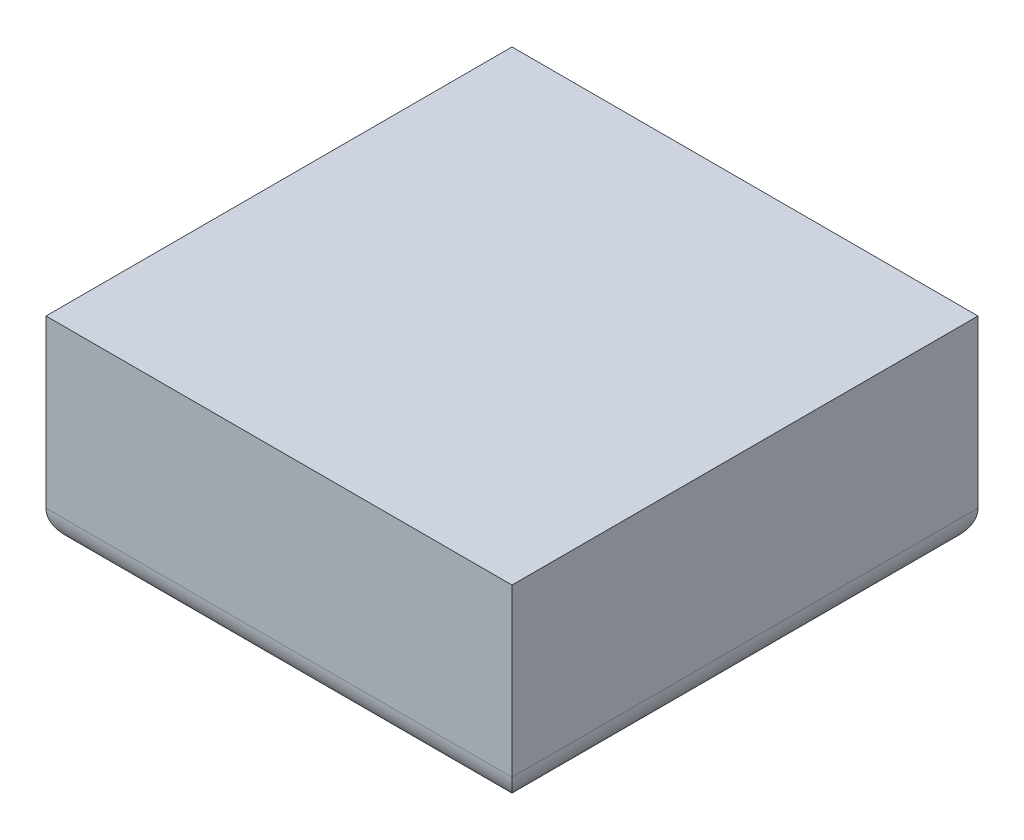
ISO-10303-21;
HEADER;
FILE_DESCRIPTION(('STEP AP214'),'2;1');
FILE_NAME('part.step','',(''),(''),'','','');
FILE_SCHEMA(('AUTOMOTIVE_DESIGN { 1 0 10303 214 1 1 1 1 }'));
ENDSEC;
DATA;
#1=APPLICATION_CONTEXT('core data for automotive mechanical design processes');
#2=APPLICATION_PROTOCOL_DEFINITION('international standard','automotive_design',2000,#1);
#3=PRODUCT_CONTEXT('',#1,'mechanical');
#4=PRODUCT('Part','Part','',(#3));
#5=PRODUCT_RELATED_PRODUCT_CATEGORY('part','',(#4));
#6=PRODUCT_DEFINITION_FORMATION('','',#4);
#7=PRODUCT_DEFINITION_CONTEXT('part definition',#1,'design');
#8=PRODUCT_DEFINITION('design','',#6,#7);
#9=PRODUCT_DEFINITION_SHAPE('','',#8);
#10=(LENGTH_UNIT() NAMED_UNIT(*) SI_UNIT(.MILLI.,.METRE.));
#11=(NAMED_UNIT(*) PLANE_ANGLE_UNIT() SI_UNIT($,.RADIAN.));
#12=(NAMED_UNIT(*) SI_UNIT($,.STERADIAN.) SOLID_ANGLE_UNIT());
#13=UNCERTAINTY_MEASURE_WITH_UNIT(LENGTH_MEASURE(1.E-05),#10,'distance_accuracy_value','');
#14=(GEOMETRIC_REPRESENTATION_CONTEXT(3) GLOBAL_UNCERTAINTY_ASSIGNED_CONTEXT((#13)) GLOBAL_UNIT_ASSIGNED_CONTEXT((#10,
#11,#12)) REPRESENTATION_CONTEXT('',''));
#15=CARTESIAN_POINT('',(0.,0.,0.));
#16=DIRECTION('',(0.,0.,1.));
#17=DIRECTION('',(1.,0.,0.));
#18=AXIS2_PLACEMENT_3D('',#15,#16,#17);
#19=CARTESIAN_POINT('',(0.,30.,0.));
#20=DIRECTION('',(1.,0.,0.));
#21=DIRECTION('',(0.,0.,-1.));
#22=AXIS2_PLACEMENT_3D('',#19,#20,#21);
#23=PLANE('',#22);
#24=DIRECTION('',(0.,-1.,0.));
#25=VECTOR('',#24,1.);
#26=CARTESIAN_POINT('',(0.,30.,-70.));
#27=LINE('',#26,#25);
#28=CARTESIAN_POINT('',(0.,30.,-70.));
#29=VERTEX_POINT('',#28);
#30=CARTESIAN_POINT('',(0.,5.,-70.));
#31=VERTEX_POINT('',#30);
#32=EDGE_CURVE('E156',#29,#31,#27,.T.);
#33=ORIENTED_EDGE('',*,*,#32,.T.);
#34=DIRECTION('',(0.,0.,1.));
#35=VECTOR('',#34,1.);
#36=CARTESIAN_POINT('',(0.,5.,0.));
#37=LINE('',#36,#35);
#38=CARTESIAN_POINT('',(0.,5.,0.));
#39=VERTEX_POINT('',#38);
#40=EDGE_CURVE('E11',#31,#39,#37,.T.);
#41=ORIENTED_EDGE('',*,*,#40,.T.);
#42=DIRECTION('',(0.,-1.,0.));
#43=VECTOR('',#42,1.);
#44=CARTESIAN_POINT('',(0.,30.,0.));
#45=LINE('',#44,#43);
#46=CARTESIAN_POINT('',(0.,30.,0.));
#47=VERTEX_POINT('',#46);
#48=EDGE_CURVE('E98',#47,#39,#45,.T.);
#49=ORIENTED_EDGE('',*,*,#48,.F.);
#50=DIRECTION('',(0.,0.,1.));
#51=VECTOR('',#50,1.);
#52=CARTESIAN_POINT('',(0.,30.,0.));
#53=LINE('',#52,#51);
#54=EDGE_CURVE('E104',#29,#47,#53,.T.);
#55=ORIENTED_EDGE('',*,*,#54,.F.);
#56=EDGE_LOOP('',(#33,#41,#49,#55));
#57=FACE_BOUND('',#56,.T.);
#58=ADVANCED_FACE('F37',(#57),#23,.F.);
#59=CARTESIAN_POINT('',(0.,30.,0.));
#60=DIRECTION('',(0.,0.,-1.));
#61=DIRECTION('',(-1.,0.,0.));
#62=AXIS2_PLACEMENT_3D('',#59,#60,#61);
#63=PLANE('',#62);
#64=ORIENTED_EDGE('',*,*,#48,.T.);
#65=DIRECTION('',(1.,0.,0.));
#66=VECTOR('',#65,1.);
#67=CARTESIAN_POINT('',(70.,5.,0.));
#68=LINE('',#67,#66);
#69=CARTESIAN_POINT('',(70.,5.,0.));
#70=VERTEX_POINT('',#69);
#71=EDGE_CURVE('E113',#39,#70,#68,.T.);
#72=ORIENTED_EDGE('',*,*,#71,.T.);
#73=DIRECTION('',(0.,-1.,0.));
#74=VECTOR('',#73,1.);
#75=CARTESIAN_POINT('',(70.,30.,0.));
#76=LINE('',#75,#74);
#77=CARTESIAN_POINT('',(70.,30.,0.));
#78=VERTEX_POINT('',#77);
#79=EDGE_CURVE('E100',#78,#70,#76,.T.);
#80=ORIENTED_EDGE('',*,*,#79,.F.);
#81=DIRECTION('',(1.,0.,0.));
#82=VECTOR('',#81,1.);
#83=CARTESIAN_POINT('',(0.,30.,0.));
#84=LINE('',#83,#82);
#85=EDGE_CURVE('E93',#47,#78,#84,.T.);
#86=ORIENTED_EDGE('',*,*,#85,.F.);
#87=EDGE_LOOP('',(#64,#72,#80,#86));
#88=FACE_BOUND('',#87,.T.);
#89=ADVANCED_FACE('F95',(#88),#63,.F.);
#90=CARTESIAN_POINT('',(70.,30.,0.));
#91=DIRECTION('',(-1.,0.,0.));
#92=DIRECTION('',(0.,0.,1.));
#93=AXIS2_PLACEMENT_3D('',#90,#91,#92);
#94=PLANE('',#93);
#95=ORIENTED_EDGE('',*,*,#79,.T.);
#96=DIRECTION('',(0.,0.,-1.));
#97=VECTOR('',#96,1.);
#98=CARTESIAN_POINT('',(70.,5.,-70.));
#99=LINE('',#98,#97);
#100=CARTESIAN_POINT('',(70.,5.,-70.));
#101=VERTEX_POINT('',#100);
#102=EDGE_CURVE('E61',#70,#101,#99,.T.);
#103=ORIENTED_EDGE('',*,*,#102,.T.);
#104=DIRECTION('',(0.,-1.,0.));
#105=VECTOR('',#104,1.);
#106=CARTESIAN_POINT('',(70.,30.,-70.));
#107=LINE('',#106,#105);
#108=CARTESIAN_POINT('',(70.,30.,-70.));
#109=VERTEX_POINT('',#108);
#110=EDGE_CURVE('E117',#109,#101,#107,.T.);
#111=ORIENTED_EDGE('',*,*,#110,.F.);
#112=DIRECTION('',(0.,0.,-1.));
#113=VECTOR('',#112,1.);
#114=CARTESIAN_POINT('',(70.,30.,0.));
#115=LINE('',#114,#113);
#116=EDGE_CURVE('E103',#78,#109,#115,.T.);
#117=ORIENTED_EDGE('',*,*,#116,.F.);
#118=EDGE_LOOP('',(#95,#103,#111,#117));
#119=FACE_BOUND('',#118,.T.);
#120=ADVANCED_FACE('F154',(#119),#94,.F.);
#121=CARTESIAN_POINT('',(0.,30.,-70.));
#122=DIRECTION('',(0.,0.,1.));
#123=DIRECTION('',(1.,0.,0.));
#124=AXIS2_PLACEMENT_3D('',#121,#122,#123);
#125=PLANE('',#124);
#126=ORIENTED_EDGE('',*,*,#110,.T.);
#127=DIRECTION('',(-1.,0.,0.));
#128=VECTOR('',#127,1.);
#129=CARTESIAN_POINT('',(0.,5.,-70.));
#130=LINE('',#129,#128);
#131=EDGE_CURVE('E46',#101,#31,#130,.T.);
#132=ORIENTED_EDGE('',*,*,#131,.T.);
#133=ORIENTED_EDGE('',*,*,#32,.F.);
#134=DIRECTION('',(-1.,0.,0.));
#135=VECTOR('',#134,1.);
#136=CARTESIAN_POINT('',(0.,30.,-70.));
#137=LINE('',#136,#135);
#138=EDGE_CURVE('E109',#109,#29,#137,.T.);
#139=ORIENTED_EDGE('',*,*,#138,.F.);
#140=EDGE_LOOP('',(#126,#132,#133,#139));
#141=FACE_BOUND('',#140,.T.);
#142=ADVANCED_FACE('F159',(#141),#125,.F.);
#143=CARTESIAN_POINT('',(0.,30.,0.));
#144=DIRECTION('',(0.,-1.,0.));
#145=DIRECTION('',(0.,0.,-1.));
#146=AXIS2_PLACEMENT_3D('',#143,#144,#145);
#147=PLANE('',#146);
#148=ORIENTED_EDGE('',*,*,#54,.T.);
#149=ORIENTED_EDGE('',*,*,#85,.T.);
#150=ORIENTED_EDGE('',*,*,#116,.T.);
#151=ORIENTED_EDGE('',*,*,#138,.T.);
#152=EDGE_LOOP('',(#148,#149,#150,#151));
#153=FACE_BOUND('',#152,.T.);
#154=ADVANCED_FACE('F107',(#153),#147,.F.);
#155=CARTESIAN_POINT('',(0.,0.,0.));
#156=DIRECTION('',(0.,-1.,0.));
#157=DIRECTION('',(0.,0.,-1.));
#158=AXIS2_PLACEMENT_3D('',#155,#156,#157);
#159=PLANE('',#158);
#160=DIRECTION('',(0.,0.,-1.));
#161=VECTOR('',#160,1.);
#162=CARTESIAN_POINT('',(65.,0.,0.));
#163=LINE('',#162,#161);
#164=CARTESIAN_POINT('',(65.,0.,-65.));
#165=VERTEX_POINT('',#164);
#166=CARTESIAN_POINT('',(65.,0.,-5.));
#167=VERTEX_POINT('',#166);
#168=EDGE_CURVE('E124',#165,#167,#163,.F.);
#169=ORIENTED_EDGE('',*,*,#168,.T.);
#170=DIRECTION('',(1.,0.,0.));
#171=VECTOR('',#170,1.);
#172=CARTESIAN_POINT('',(0.,0.,-5.));
#173=LINE('',#172,#171);
#174=CARTESIAN_POINT('',(5.,0.,-5.));
#175=VERTEX_POINT('',#174);
#176=EDGE_CURVE('E126',#167,#175,#173,.F.);
#177=ORIENTED_EDGE('',*,*,#176,.T.);
#178=DIRECTION('',(0.,0.,1.));
#179=VECTOR('',#178,1.);
#180=CARTESIAN_POINT('',(5.,0.,-70.));
#181=LINE('',#180,#179);
#182=CARTESIAN_POINT('',(5.,0.,-65.));
#183=VERTEX_POINT('',#182);
#184=EDGE_CURVE('E115',#175,#183,#181,.F.);
#185=ORIENTED_EDGE('',*,*,#184,.T.);
#186=DIRECTION('',(-1.,0.,0.));
#187=VECTOR('',#186,1.);
#188=CARTESIAN_POINT('',(70.,0.,-65.));
#189=LINE('',#188,#187);
#190=EDGE_CURVE('E122',#183,#165,#189,.F.);
#191=ORIENTED_EDGE('',*,*,#190,.T.);
#192=EDGE_LOOP('',(#169,#177,#185,#191));
#193=FACE_BOUND('',#192,.T.);
#194=ADVANCED_FACE('F147',(#193),#159,.T.);
#195=CARTESIAN_POINT('',(0.,5.,-65.));
#196=DIRECTION('',(1.,0.,0.));
#197=DIRECTION('',(0.,0.,-1.));
#198=AXIS2_PLACEMENT_3D('',#195,#196,#197);
#199=CYLINDRICAL_SURFACE('',#198,5.);
#200=CARTESIAN_POINT('',(65.,5.,-65.));
#201=DIRECTION('',(0.707106781186547,0.,0.707106781186547));
#202=DIRECTION('',(0.707106781186547,0.,-0.707106781186547));
#203=AXIS2_PLACEMENT_3D('',#200,#201,#202);
#204=ELLIPSE('',#203,7.07106781186547,5.);
#205=EDGE_CURVE('E134',#165,#101,#204,.T.);
#206=ORIENTED_EDGE('',*,*,#205,.F.);
#207=ORIENTED_EDGE('',*,*,#190,.F.);
#208=CARTESIAN_POINT('',(5.,5.,-65.));
#209=DIRECTION('',(0.707106781186547,0.,-0.707106781186547));
#210=DIRECTION('',(-0.707106781186547,0.,-0.707106781186547));
#211=AXIS2_PLACEMENT_3D('',#208,#209,#210);
#212=ELLIPSE('',#211,7.07106781186547,5.);
#213=EDGE_CURVE('E41',#31,#183,#212,.F.);
#214=ORIENTED_EDGE('',*,*,#213,.F.);
#215=ORIENTED_EDGE('',*,*,#131,.F.);
#216=EDGE_LOOP('',(#206,#207,#214,#215));
#217=FACE_BOUND('',#216,.T.);
#218=ADVANCED_FACE('F39',(#217),#199,.T.);
#219=CARTESIAN_POINT('',(5.,5.,0.));
#220=DIRECTION('',(0.,0.,-1.));
#221=DIRECTION('',(-1.,0.,0.));
#222=AXIS2_PLACEMENT_3D('',#219,#220,#221);
#223=CYLINDRICAL_SURFACE('',#222,5.);
#224=ORIENTED_EDGE('',*,*,#213,.T.);
#225=ORIENTED_EDGE('',*,*,#184,.F.);
#226=CARTESIAN_POINT('',(5.,5.,-5.));
#227=DIRECTION('',(-0.707106781186547,0.,-0.707106781186547));
#228=DIRECTION('',(0.707106781186547,0.,-0.707106781186547));
#229=AXIS2_PLACEMENT_3D('',#226,#227,#228);
#230=ELLIPSE('',#229,7.07106781186547,5.);
#231=EDGE_CURVE('E133',#39,#175,#230,.F.);
#232=ORIENTED_EDGE('',*,*,#231,.F.);
#233=ORIENTED_EDGE('',*,*,#40,.F.);
#234=EDGE_LOOP('',(#224,#225,#232,#233));
#235=FACE_BOUND('',#234,.T.);
#236=ADVANCED_FACE('F143',(#235),#223,.T.);
#237=CARTESIAN_POINT('',(65.,5.,0.));
#238=DIRECTION('',(0.,0.,1.));
#239=DIRECTION('',(1.,0.,0.));
#240=AXIS2_PLACEMENT_3D('',#237,#238,#239);
#241=CYLINDRICAL_SURFACE('',#240,5.);
#242=ORIENTED_EDGE('',*,*,#205,.T.);
#243=ORIENTED_EDGE('',*,*,#102,.F.);
#244=CARTESIAN_POINT('',(65.,5.,-5.));
#245=DIRECTION('',(-0.707106781186547,0.,0.707106781186547));
#246=DIRECTION('',(0.707106781186547,0.,0.707106781186547));
#247=AXIS2_PLACEMENT_3D('',#244,#245,#246);
#248=ELLIPSE('',#247,7.07106781186547,5.);
#249=EDGE_CURVE('E131',#167,#70,#248,.T.);
#250=ORIENTED_EDGE('',*,*,#249,.F.);
#251=ORIENTED_EDGE('',*,*,#168,.F.);
#252=EDGE_LOOP('',(#242,#243,#250,#251));
#253=FACE_BOUND('',#252,.T.);
#254=ADVANCED_FACE('F153',(#253),#241,.T.);
#255=CARTESIAN_POINT('',(0.,5.,-5.));
#256=DIRECTION('',(-1.,0.,0.));
#257=DIRECTION('',(0.,0.,1.));
#258=AXIS2_PLACEMENT_3D('',#255,#256,#257);
#259=CYLINDRICAL_SURFACE('',#258,5.);
#260=ORIENTED_EDGE('',*,*,#231,.T.);
#261=ORIENTED_EDGE('',*,*,#176,.F.);
#262=ORIENTED_EDGE('',*,*,#249,.T.);
#263=ORIENTED_EDGE('',*,*,#71,.F.);
#264=EDGE_LOOP('',(#260,#261,#262,#263));
#265=FACE_BOUND('',#264,.T.);
#266=ADVANCED_FACE('F151',(#265),#259,.T.);
#267=CLOSED_SHELL('',(#58,#89,#120,#142,#154,#194,#218,#236,#254,#266));
#268=MANIFOLD_SOLID_BREP('B2',#267);
#269=ADVANCED_BREP_SHAPE_REPRESENTATION('',(#18,#268),#14);
#270=SHAPE_DEFINITION_REPRESENTATION(#9,#269);
ENDSEC;
END-ISO-10303-21;
